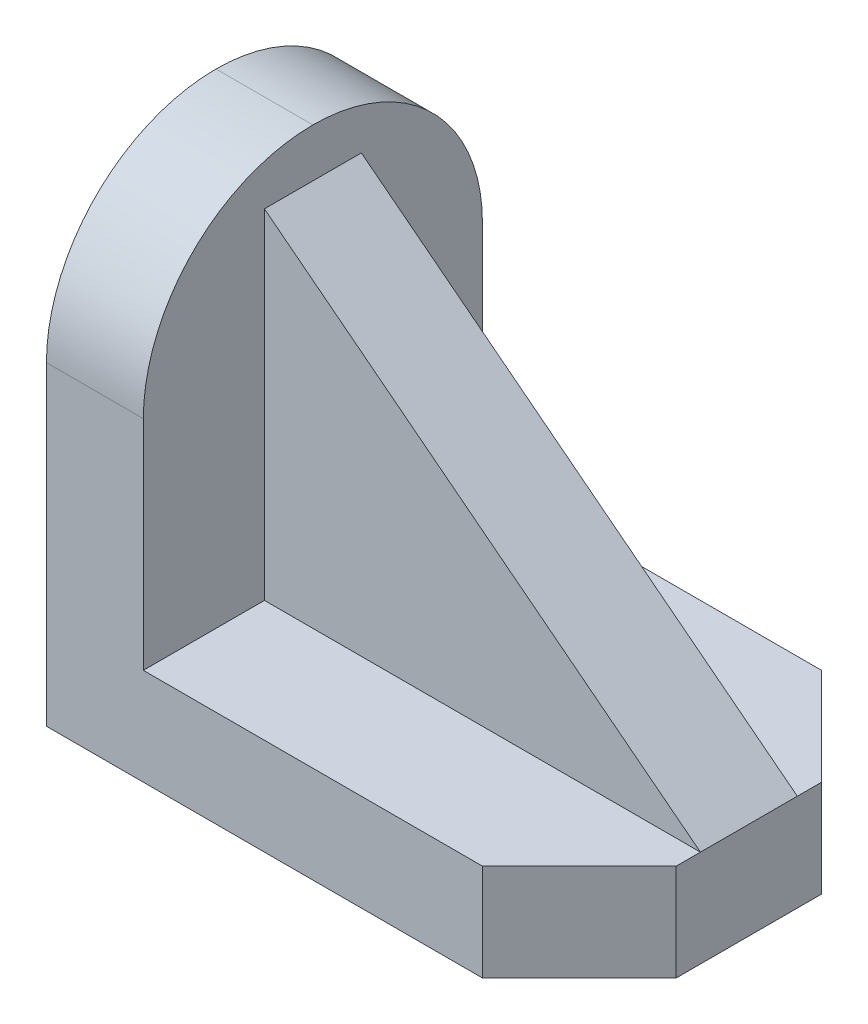
ISO-10303-21;
HEADER;
FILE_DESCRIPTION(('STEP AP214'),'2;1');
FILE_NAME('part.step','',(''),(''),'','','');
FILE_SCHEMA(('AUTOMOTIVE_DESIGN { 1 0 10303 214 1 1 1 1 }'));
ENDSEC;
DATA;
#1=APPLICATION_CONTEXT('core data for automotive mechanical design processes');
#2=APPLICATION_PROTOCOL_DEFINITION('international standard','automotive_design',2000,#1);
#3=PRODUCT_CONTEXT('',#1,'mechanical');
#4=PRODUCT('Part','Part','',(#3));
#5=PRODUCT_RELATED_PRODUCT_CATEGORY('part','',(#4));
#6=PRODUCT_DEFINITION_FORMATION('','',#4);
#7=PRODUCT_DEFINITION_CONTEXT('part definition',#1,'design');
#8=PRODUCT_DEFINITION('design','',#6,#7);
#9=PRODUCT_DEFINITION_SHAPE('','',#8);
#10=(LENGTH_UNIT() NAMED_UNIT(*) SI_UNIT(.MILLI.,.METRE.));
#11=(NAMED_UNIT(*) PLANE_ANGLE_UNIT() SI_UNIT($,.RADIAN.));
#12=(NAMED_UNIT(*) SI_UNIT($,.STERADIAN.) SOLID_ANGLE_UNIT());
#13=UNCERTAINTY_MEASURE_WITH_UNIT(LENGTH_MEASURE(1.E-05),#10,'distance_accuracy_value','');
#14=(GEOMETRIC_REPRESENTATION_CONTEXT(3) GLOBAL_UNCERTAINTY_ASSIGNED_CONTEXT((#13)) GLOBAL_UNIT_ASSIGNED_CONTEXT((#10,
#11,#12)) REPRESENTATION_CONTEXT('',''));
#15=CARTESIAN_POINT('',(0.,0.,0.));
#16=DIRECTION('',(0.,0.,1.));
#17=DIRECTION('',(1.,0.,0.));
#18=AXIS2_PLACEMENT_3D('',#15,#16,#17);
#19=CARTESIAN_POINT('',(0.,12000.,0.));
#20=DIRECTION('',(0.,1.,0.));
#21=DIRECTION('',(0.,0.,1.));
#22=AXIS2_PLACEMENT_3D('',#19,#20,#21);
#23=PLANE('',#22);
#24=DIRECTION('',(0.,0.,1.));
#25=VECTOR('',#24,1.);
#26=CARTESIAN_POINT('',(-21000.,12000.,-21000.));
#27=LINE('',#26,#25);
#28=CARTESIAN_POINT('',(-21000.,12000.,6000.));
#29=VERTEX_POINT('',#28);
#30=CARTESIAN_POINT('',(-21000.,12000.,21000.));
#31=VERTEX_POINT('',#30);
#32=EDGE_CURVE('E57',#29,#31,#27,.T.);
#33=ORIENTED_EDGE('',*,*,#32,.T.);
#34=DIRECTION('',(1.,0.,0.));
#35=VECTOR('',#34,1.);
#36=CARTESIAN_POINT('',(-33000.,12000.,21000.));
#37=LINE('',#36,#35);
#38=CARTESIAN_POINT('',(21000.,12000.,21000.));
#39=VERTEX_POINT('',#38);
#40=EDGE_CURVE('E138',#31,#39,#37,.T.);
#41=ORIENTED_EDGE('',*,*,#40,.T.);
#42=DIRECTION('',(-0.707106781186548,0.,0.707106781186548));
#43=VECTOR('',#42,1.);
#44=CARTESIAN_POINT('',(21000.,12000.,21000.));
#45=LINE('',#44,#43);
#46=CARTESIAN_POINT('',(33000.,12000.,8999.99999999996));
#47=VERTEX_POINT('',#46);
#48=EDGE_CURVE('E223',#39,#47,#45,.F.);
#49=ORIENTED_EDGE('',*,*,#48,.T.);
#50=DIRECTION('',(0.,0.,-1.));
#51=VECTOR('',#50,1.);
#52=CARTESIAN_POINT('',(33000.,12000.,-21000.));
#53=LINE('',#52,#51);
#54=CARTESIAN_POINT('',(33000.,12000.,6000.));
#55=VERTEX_POINT('',#54);
#56=EDGE_CURVE('E218',#47,#55,#53,.T.);
#57=ORIENTED_EDGE('',*,*,#56,.T.);
#58=DIRECTION('',(1.,0.,0.));
#59=VECTOR('',#58,1.);
#60=CARTESIAN_POINT('',(-21000.,12000.,6000.));
#61=LINE('',#60,#59);
#62=EDGE_CURVE('E171',#29,#55,#61,.T.);
#63=ORIENTED_EDGE('',*,*,#62,.F.);
#64=EDGE_LOOP('',(#33,#41,#49,#57,#63));
#65=FACE_BOUND('',#64,.T.);
#66=ADVANCED_FACE('F32',(#65),#23,.T.);
#67=CARTESIAN_POINT('',(-21000.,12000.,-21000.));
#68=VERTEX_POINT('',#67);
#69=CARTESIAN_POINT('',(-21000.,12000.,-6000.));
#70=VERTEX_POINT('',#69);
#71=EDGE_CURVE('E157',#68,#70,#27,.T.);
#72=ORIENTED_EDGE('',*,*,#71,.T.);
#73=DIRECTION('',(1.,0.,0.));
#74=VECTOR('',#73,1.);
#75=CARTESIAN_POINT('',(-21000.,12000.,-6000.));
#76=LINE('',#75,#74);
#77=CARTESIAN_POINT('',(33000.,12000.,-6000.));
#78=VERTEX_POINT('',#77);
#79=EDGE_CURVE('E176',#70,#78,#76,.T.);
#80=ORIENTED_EDGE('',*,*,#79,.T.);
#81=CARTESIAN_POINT('',(33000.,12000.,-8999.99999999998));
#82=VERTEX_POINT('',#81);
#83=EDGE_CURVE('E221',#78,#82,#53,.T.);
#84=ORIENTED_EDGE('',*,*,#83,.T.);
#85=DIRECTION('',(0.707106781186548,0.,0.707106781186548));
#86=VECTOR('',#85,1.);
#87=CARTESIAN_POINT('',(21000.,12000.,-21000.));
#88=LINE('',#87,#86);
#89=CARTESIAN_POINT('',(21000.,12000.,-21000.));
#90=VERTEX_POINT('',#89);
#91=EDGE_CURVE('E41',#82,#90,#88,.F.);
#92=ORIENTED_EDGE('',*,*,#91,.T.);
#93=DIRECTION('',(-1.,0.,0.));
#94=VECTOR('',#93,1.);
#95=CARTESIAN_POINT('',(-33000.,12000.,-21000.));
#96=LINE('',#95,#94);
#97=EDGE_CURVE('E49',#90,#68,#96,.T.);
#98=ORIENTED_EDGE('',*,*,#97,.T.);
#99=EDGE_LOOP('',(#72,#80,#84,#92,#98));
#100=FACE_BOUND('',#99,.T.);
#101=ADVANCED_FACE('F249',(#100),#23,.T.);
#102=CARTESIAN_POINT('',(33000.,12000.,-21000.));
#103=DIRECTION('',(-1.,0.,0.));
#104=DIRECTION('',(0.,0.,1.));
#105=AXIS2_PLACEMENT_3D('',#102,#103,#104);
#106=PLANE('',#105);
#107=DIRECTION('',(0.,0.,-1.));
#108=VECTOR('',#107,1.);
#109=CARTESIAN_POINT('',(33000.,0.,-21000.));
#110=LINE('',#109,#108);
#111=CARTESIAN_POINT('',(33000.,0.,8999.99999999997));
#112=VERTEX_POINT('',#111);
#113=CARTESIAN_POINT('',(33000.,0.,-8999.99999999998));
#114=VERTEX_POINT('',#113);
#115=EDGE_CURVE('E200',#112,#114,#110,.T.);
#116=ORIENTED_EDGE('',*,*,#115,.T.);
#117=DIRECTION('',(0.,1.,0.));
#118=VECTOR('',#117,1.);
#119=CARTESIAN_POINT('',(33000.,12000.,-8999.99999999998));
#120=LINE('',#119,#118);
#121=EDGE_CURVE('E246',#114,#82,#120,.T.);
#122=ORIENTED_EDGE('',*,*,#121,.T.);
#123=ORIENTED_EDGE('',*,*,#83,.F.);
#124=DIRECTION('',(0.,0.,-1.));
#125=VECTOR('',#124,1.);
#126=CARTESIAN_POINT('',(33000.,12000.,6000.));
#127=LINE('',#126,#125);
#128=EDGE_CURVE('E195',#55,#78,#127,.T.);
#129=ORIENTED_EDGE('',*,*,#128,.F.);
#130=ORIENTED_EDGE('',*,*,#56,.F.);
#131=DIRECTION('',(0.,-1.,0.));
#132=VECTOR('',#131,1.);
#133=CARTESIAN_POINT('',(33000.,12000.,8999.99999999998));
#134=LINE('',#133,#132);
#135=EDGE_CURVE('E244',#47,#112,#134,.T.);
#136=ORIENTED_EDGE('',*,*,#135,.T.);
#137=EDGE_LOOP('',(#116,#122,#123,#129,#130,#136));
#138=FACE_BOUND('',#137,.T.);
#139=ADVANCED_FACE('F216',(#138),#106,.F.);
#140=CARTESIAN_POINT('',(-33000.,12000.,-21000.));
#141=DIRECTION('',(0.,0.,1.));
#142=DIRECTION('',(1.,0.,0.));
#143=AXIS2_PLACEMENT_3D('',#140,#141,#142);
#144=PLANE('',#143);
#145=ORIENTED_EDGE('',*,*,#97,.F.);
#146=DIRECTION('',(0.,-1.,0.));
#147=VECTOR('',#146,1.);
#148=CARTESIAN_POINT('',(21000.,12000.,-21000.));
#149=LINE('',#148,#147);
#150=CARTESIAN_POINT('',(21000.,0.,-21000.));
#151=VERTEX_POINT('',#150);
#152=EDGE_CURVE('E237',#90,#151,#149,.T.);
#153=ORIENTED_EDGE('',*,*,#152,.T.);
#154=DIRECTION('',(-1.,0.,0.));
#155=VECTOR('',#154,1.);
#156=CARTESIAN_POINT('',(-33000.,0.,-21000.));
#157=LINE('',#156,#155);
#158=CARTESIAN_POINT('',(-33000.,0.,-21000.));
#159=VERTEX_POINT('',#158);
#160=EDGE_CURVE('E202',#151,#159,#157,.T.);
#161=ORIENTED_EDGE('',*,*,#160,.T.);
#162=DIRECTION('',(0.,-1.,0.));
#163=VECTOR('',#162,1.);
#164=CARTESIAN_POINT('',(-33000.,12000.,-21000.));
#165=LINE('',#164,#163);
#166=CARTESIAN_POINT('',(-33000.,39000.,-21000.));
#167=VERTEX_POINT('',#166);
#168=EDGE_CURVE('E137',#167,#159,#165,.T.);
#169=ORIENTED_EDGE('',*,*,#168,.F.);
#170=DIRECTION('',(-1.,0.,0.));
#171=VECTOR('',#170,1.);
#172=CARTESIAN_POINT('',(-21000.,39000.,-21000.));
#173=LINE('',#172,#171);
#174=CARTESIAN_POINT('',(-21000.,39000.,-21000.));
#175=VERTEX_POINT('',#174);
#176=EDGE_CURVE('E164',#167,#175,#173,.F.);
#177=ORIENTED_EDGE('',*,*,#176,.T.);
#178=DIRECTION('',(0.,-1.,0.));
#179=VECTOR('',#178,1.);
#180=CARTESIAN_POINT('',(-21000.,12000.,-21000.));
#181=LINE('',#180,#179);
#182=EDGE_CURVE('E168',#175,#68,#181,.T.);
#183=ORIENTED_EDGE('',*,*,#182,.T.);
#184=EDGE_LOOP('',(#145,#153,#161,#169,#177,#183));
#185=FACE_BOUND('',#184,.T.);
#186=ADVANCED_FACE('F254',(#185),#144,.F.);
#187=CARTESIAN_POINT('',(-33000.,12000.,-21000.));
#188=DIRECTION('',(1.,0.,0.));
#189=DIRECTION('',(0.,0.,-1.));
#190=AXIS2_PLACEMENT_3D('',#187,#188,#189);
#191=PLANE('',#190);
#192=DIRECTION('',(0.,0.,1.));
#193=VECTOR('',#192,1.);
#194=CARTESIAN_POINT('',(-33000.,0.,-21000.));
#195=LINE('',#194,#193);
#196=CARTESIAN_POINT('',(-33000.,0.,21000.));
#197=VERTEX_POINT('',#196);
#198=EDGE_CURVE('E132',#159,#197,#195,.T.);
#199=ORIENTED_EDGE('',*,*,#198,.T.);
#200=DIRECTION('',(0.,-1.,0.));
#201=VECTOR('',#200,1.);
#202=CARTESIAN_POINT('',(-33000.,12000.,21000.));
#203=LINE('',#202,#201);
#204=CARTESIAN_POINT('',(-33000.,39000.,21000.));
#205=VERTEX_POINT('',#204);
#206=EDGE_CURVE('E124',#205,#197,#203,.T.);
#207=ORIENTED_EDGE('',*,*,#206,.F.);
#208=CARTESIAN_POINT('',(-33000.,39000.,0.));
#209=DIRECTION('',(1.,0.,0.));
#210=DIRECTION('',(0.,0.,-1.));
#211=AXIS2_PLACEMENT_3D('',#208,#209,#210);
#212=CIRCLE('',#211,21000.);
#213=CARTESIAN_POINT('',(-33000.,60000.,0.));
#214=VERTEX_POINT('',#213);
#215=EDGE_CURVE('E128',#205,#214,#212,.F.);
#216=ORIENTED_EDGE('',*,*,#215,.T.);
#217=CARTESIAN_POINT('',(-33000.,39000.,0.));
#218=DIRECTION('',(1.,0.,0.));
#219=DIRECTION('',(0.,0.,-1.));
#220=AXIS2_PLACEMENT_3D('',#217,#218,#219);
#221=CIRCLE('',#220,21000.);
#222=EDGE_CURVE('E149',#214,#167,#221,.F.);
#223=ORIENTED_EDGE('',*,*,#222,.T.);
#224=ORIENTED_EDGE('',*,*,#168,.T.);
#225=EDGE_LOOP('',(#199,#207,#216,#223,#224));
#226=FACE_BOUND('',#225,.T.);
#227=ADVANCED_FACE('F126',(#226),#191,.F.);
#228=CARTESIAN_POINT('',(-33000.,12000.,21000.));
#229=DIRECTION('',(0.,0.,-1.));
#230=DIRECTION('',(-1.,0.,0.));
#231=AXIS2_PLACEMENT_3D('',#228,#229,#230);
#232=PLANE('',#231);
#233=DIRECTION('',(1.,0.,0.));
#234=VECTOR('',#233,1.);
#235=CARTESIAN_POINT('',(-33000.,0.,21000.));
#236=LINE('',#235,#234);
#237=CARTESIAN_POINT('',(21000.,0.,21000.));
#238=VERTEX_POINT('',#237);
#239=EDGE_CURVE('E226',#197,#238,#236,.T.);
#240=ORIENTED_EDGE('',*,*,#239,.T.);
#241=DIRECTION('',(0.,1.,0.));
#242=VECTOR('',#241,1.);
#243=CARTESIAN_POINT('',(21000.,12000.,21000.));
#244=LINE('',#243,#242);
#245=EDGE_CURVE('E11',#238,#39,#244,.T.);
#246=ORIENTED_EDGE('',*,*,#245,.T.);
#247=ORIENTED_EDGE('',*,*,#40,.F.);
#248=DIRECTION('',(0.,1.,0.));
#249=VECTOR('',#248,1.);
#250=CARTESIAN_POINT('',(-21000.,12000.,21000.));
#251=LINE('',#250,#249);
#252=CARTESIAN_POINT('',(-21000.,39000.,21000.));
#253=VERTEX_POINT('',#252);
#254=EDGE_CURVE('E154',#31,#253,#251,.T.);
#255=ORIENTED_EDGE('',*,*,#254,.T.);
#256=DIRECTION('',(-1.,0.,0.));
#257=VECTOR('',#256,1.);
#258=CARTESIAN_POINT('',(-21000.,39000.,21000.));
#259=LINE('',#258,#257);
#260=EDGE_CURVE('E145',#253,#205,#259,.T.);
#261=ORIENTED_EDGE('',*,*,#260,.T.);
#262=ORIENTED_EDGE('',*,*,#206,.T.);
#263=EDGE_LOOP('',(#240,#246,#247,#255,#261,#262));
#264=FACE_BOUND('',#263,.T.);
#265=ADVANCED_FACE('F152',(#264),#232,.F.);
#266=CARTESIAN_POINT('',(0.,0.,0.));
#267=DIRECTION('',(0.,1.,0.));
#268=DIRECTION('',(0.,0.,1.));
#269=AXIS2_PLACEMENT_3D('',#266,#267,#268);
#270=PLANE('',#269);
#271=ORIENTED_EDGE('',*,*,#160,.F.);
#272=DIRECTION('',(-0.707106781186548,0.,-0.707106781186548));
#273=VECTOR('',#272,1.);
#274=CARTESIAN_POINT('',(21000.,0.,-21000.));
#275=LINE('',#274,#273);
#276=EDGE_CURVE('E242',#151,#114,#275,.F.);
#277=ORIENTED_EDGE('',*,*,#276,.T.);
#278=ORIENTED_EDGE('',*,*,#115,.F.);
#279=DIRECTION('',(0.707106781186548,0.,-0.707106781186548));
#280=VECTOR('',#279,1.);
#281=CARTESIAN_POINT('',(33000.,0.,8999.99999999998));
#282=LINE('',#281,#280);
#283=EDGE_CURVE('E240',#112,#238,#282,.F.);
#284=ORIENTED_EDGE('',*,*,#283,.T.);
#285=ORIENTED_EDGE('',*,*,#239,.F.);
#286=ORIENTED_EDGE('',*,*,#198,.F.);
#287=EDGE_LOOP('',(#271,#277,#278,#284,#285,#286));
#288=FACE_BOUND('',#287,.T.);
#289=ADVANCED_FACE('F260',(#288),#270,.F.);
#290=CARTESIAN_POINT('',(21000.,12000.,-21000.));
#291=DIRECTION('',(-0.707106781186548,0.,0.707106781186548));
#292=DIRECTION('',(0.,-1.,0.));
#293=AXIS2_PLACEMENT_3D('',#290,#291,#292);
#294=PLANE('',#293);
#295=ORIENTED_EDGE('',*,*,#91,.F.);
#296=ORIENTED_EDGE('',*,*,#121,.F.);
#297=ORIENTED_EDGE('',*,*,#276,.F.);
#298=ORIENTED_EDGE('',*,*,#152,.F.);
#299=EDGE_LOOP('',(#295,#296,#297,#298));
#300=FACE_BOUND('',#299,.T.);
#301=ADVANCED_FACE('F257',(#300),#294,.F.);
#302=CARTESIAN_POINT('',(33000.,12000.,8999.99999999998));
#303=DIRECTION('',(-0.707106781186548,0.,-0.707106781186548));
#304=DIRECTION('',(0.,-1.,0.));
#305=AXIS2_PLACEMENT_3D('',#302,#303,#304);
#306=PLANE('',#305);
#307=ORIENTED_EDGE('',*,*,#48,.F.);
#308=ORIENTED_EDGE('',*,*,#245,.F.);
#309=ORIENTED_EDGE('',*,*,#283,.F.);
#310=ORIENTED_EDGE('',*,*,#135,.F.);
#311=EDGE_LOOP('',(#307,#308,#309,#310));
#312=FACE_BOUND('',#311,.T.);
#313=ADVANCED_FACE('F34',(#312),#306,.F.);
#314=CARTESIAN_POINT('',(33000.,12000.,6000.));
#315=DIRECTION('',(-0.61394061351492,-0.789352217376326,0.));
#316=DIRECTION('',(0.789352217376326,-0.613940613514921,0.));
#317=AXIS2_PLACEMENT_3D('',#314,#315,#316);
#318=PLANE('',#317);
#319=DIRECTION('',(-0.789352217376326,0.61394061351492,0.));
#320=VECTOR('',#319,1.);
#321=CARTESIAN_POINT('',(33000.,12000.,-6000.));
#322=LINE('',#321,#320);
#323=CARTESIAN_POINT('',(-21000.,54000.,-6000.));
#324=VERTEX_POINT('',#323);
#325=EDGE_CURVE('E166',#78,#324,#322,.T.);
#326=ORIENTED_EDGE('',*,*,#325,.T.);
#327=DIRECTION('',(0.,0.,-1.));
#328=VECTOR('',#327,1.);
#329=CARTESIAN_POINT('',(-21000.,54000.,6000.));
#330=LINE('',#329,#328);
#331=CARTESIAN_POINT('',(-21000.,54000.,6000.));
#332=VERTEX_POINT('',#331);
#333=EDGE_CURVE('E179',#332,#324,#330,.T.);
#334=ORIENTED_EDGE('',*,*,#333,.F.);
#335=DIRECTION('',(-0.789352217376326,0.61394061351492,0.));
#336=VECTOR('',#335,1.);
#337=CARTESIAN_POINT('',(33000.,12000.,6000.));
#338=LINE('',#337,#336);
#339=EDGE_CURVE('E172',#55,#332,#338,.T.);
#340=ORIENTED_EDGE('',*,*,#339,.F.);
#341=ORIENTED_EDGE('',*,*,#128,.T.);
#342=EDGE_LOOP('',(#326,#334,#340,#341));
#343=FACE_BOUND('',#342,.T.);
#344=ADVANCED_FACE('F191',(#343),#318,.F.);
#345=CARTESIAN_POINT('',(0.,0.,6000.));
#346=DIRECTION('',(0.,0.,1.));
#347=DIRECTION('',(1.,0.,0.));
#348=AXIS2_PLACEMENT_3D('',#345,#346,#347);
#349=PLANE('',#348);
#350=ORIENTED_EDGE('',*,*,#339,.T.);
#351=DIRECTION('',(0.,-1.,0.));
#352=VECTOR('',#351,1.);
#353=CARTESIAN_POINT('',(-21000.,54000.,6000.));
#354=LINE('',#353,#352);
#355=EDGE_CURVE('E169',#332,#29,#354,.T.);
#356=ORIENTED_EDGE('',*,*,#355,.T.);
#357=ORIENTED_EDGE('',*,*,#62,.T.);
#358=EDGE_LOOP('',(#350,#356,#357));
#359=FACE_BOUND('',#358,.T.);
#360=ADVANCED_FACE('F211',(#359),#349,.T.);
#361=CARTESIAN_POINT('',(0.,0.,-6000.));
#362=DIRECTION('',(0.,0.,1.));
#363=DIRECTION('',(1.,0.,0.));
#364=AXIS2_PLACEMENT_3D('',#361,#362,#363);
#365=PLANE('',#364);
#366=ORIENTED_EDGE('',*,*,#325,.F.);
#367=ORIENTED_EDGE('',*,*,#79,.F.);
#368=DIRECTION('',(0.,-1.,0.));
#369=VECTOR('',#368,1.);
#370=CARTESIAN_POINT('',(-21000.,54000.,-6000.));
#371=LINE('',#370,#369);
#372=EDGE_CURVE('E173',#324,#70,#371,.T.);
#373=ORIENTED_EDGE('',*,*,#372,.F.);
#374=EDGE_LOOP('',(#366,#367,#373));
#375=FACE_BOUND('',#374,.T.);
#376=ADVANCED_FACE('F274',(#375),#365,.F.);
#377=CARTESIAN_POINT('',(-21000.,0.,0.));
#378=DIRECTION('',(1.,0.,0.));
#379=DIRECTION('',(0.,0.,-1.));
#380=AXIS2_PLACEMENT_3D('',#377,#378,#379);
#381=PLANE('',#380);
#382=ORIENTED_EDGE('',*,*,#32,.F.);
#383=ORIENTED_EDGE('',*,*,#355,.F.);
#384=ORIENTED_EDGE('',*,*,#333,.T.);
#385=ORIENTED_EDGE('',*,*,#372,.T.);
#386=ORIENTED_EDGE('',*,*,#71,.F.);
#387=ORIENTED_EDGE('',*,*,#182,.F.);
#388=CARTESIAN_POINT('',(-21000.,39000.,0.));
#389=DIRECTION('',(1.,0.,0.));
#390=DIRECTION('',(0.,0.,-1.));
#391=AXIS2_PLACEMENT_3D('',#388,#389,#390);
#392=CIRCLE('',#391,21000.);
#393=CARTESIAN_POINT('',(-21000.,60000.,0.));
#394=VERTEX_POINT('',#393);
#395=EDGE_CURVE('E148',#175,#394,#392,.T.);
#396=ORIENTED_EDGE('',*,*,#395,.T.);
#397=CARTESIAN_POINT('',(-21000.,39000.,0.));
#398=DIRECTION('',(1.,0.,0.));
#399=DIRECTION('',(0.,0.,-1.));
#400=AXIS2_PLACEMENT_3D('',#397,#398,#399);
#401=CIRCLE('',#400,21000.);
#402=EDGE_CURVE('E162',#394,#253,#401,.T.);
#403=ORIENTED_EDGE('',*,*,#402,.T.);
#404=ORIENTED_EDGE('',*,*,#254,.F.);
#405=EDGE_LOOP('',(#382,#383,#384,#385,#386,#387,#396,#403,#404));
#406=FACE_BOUND('',#405,.T.);
#407=ADVANCED_FACE('F198',(#406),#381,.T.);
#408=CARTESIAN_POINT('',(-21000.,39000.,0.));
#409=DIRECTION('',(-1.,0.,0.));
#410=DIRECTION('',(0.,0.,1.));
#411=AXIS2_PLACEMENT_3D('',#408,#409,#410);
#412=CYLINDRICAL_SURFACE('',#411,21000.);
#413=DIRECTION('',(-1.,0.,0.));
#414=VECTOR('',#413,1.);
#415=CARTESIAN_POINT('',(-21000.,60000.,0.));
#416=LINE('',#415,#414);
#417=EDGE_CURVE('E147',#394,#214,#416,.T.);
#418=ORIENTED_EDGE('',*,*,#417,.F.);
#419=ORIENTED_EDGE('',*,*,#395,.F.);
#420=ORIENTED_EDGE('',*,*,#176,.F.);
#421=ORIENTED_EDGE('',*,*,#222,.F.);
#422=EDGE_LOOP('',(#418,#419,#420,#421));
#423=FACE_BOUND('',#422,.T.);
#424=ADVANCED_FACE('F266',(#423),#412,.T.);
#425=CARTESIAN_POINT('',(-21000.,39000.,0.));
#426=DIRECTION('',(-1.,0.,0.));
#427=DIRECTION('',(0.,0.,1.));
#428=AXIS2_PLACEMENT_3D('',#425,#426,#427);
#429=CYLINDRICAL_SURFACE('',#428,21000.);
#430=ORIENTED_EDGE('',*,*,#402,.F.);
#431=ORIENTED_EDGE('',*,*,#417,.T.);
#432=ORIENTED_EDGE('',*,*,#215,.F.);
#433=ORIENTED_EDGE('',*,*,#260,.F.);
#434=EDGE_LOOP('',(#430,#431,#432,#433));
#435=FACE_BOUND('',#434,.T.);
#436=ADVANCED_FACE('F144',(#435),#429,.T.);
#437=CLOSED_SHELL('',(#66,#101,#139,#186,#227,#265,#289,#301,#313,#344,#360,#376,#407,#424,#436));
#438=MANIFOLD_SOLID_BREP('B2',#437);
#439=ADVANCED_BREP_SHAPE_REPRESENTATION('',(#18,#438),#14);
#440=SHAPE_DEFINITION_REPRESENTATION(#9,#439);
ENDSEC;
END-ISO-10303-21;
